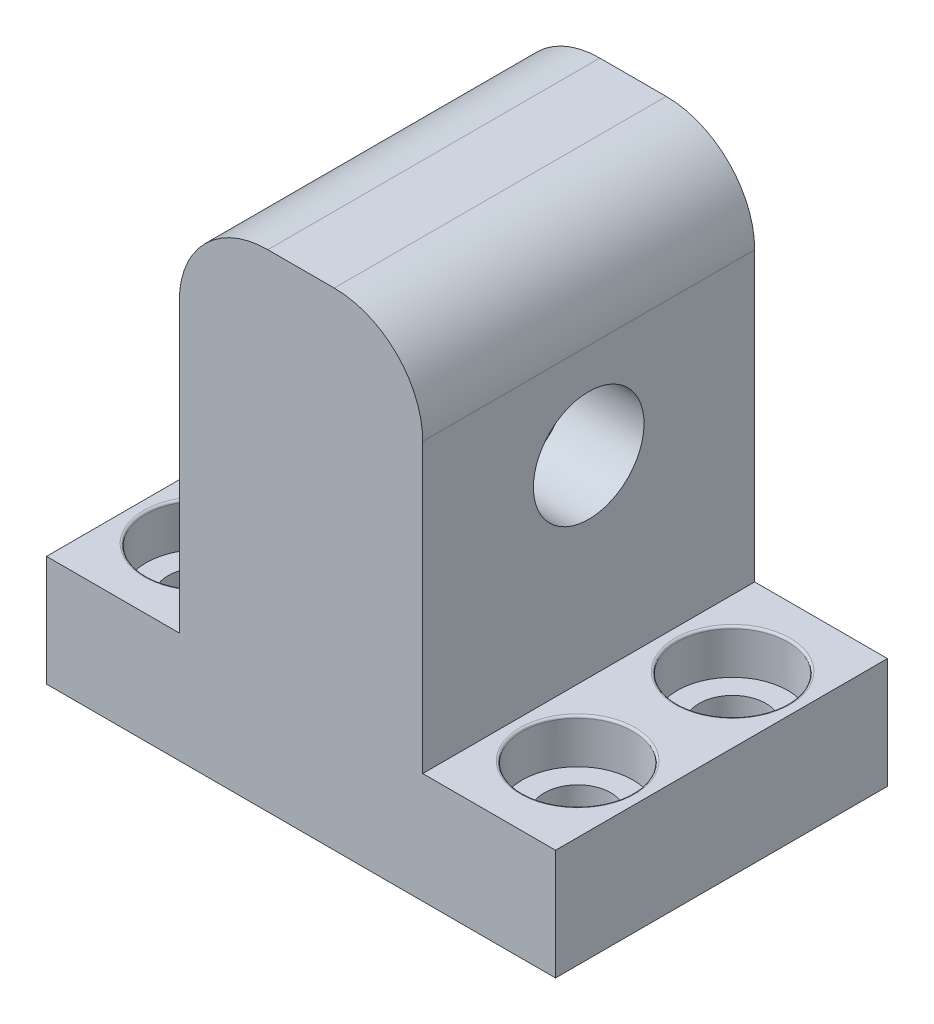
ISO-10303-21;
HEADER;
FILE_DESCRIPTION(('STEP AP214'),'2;1');
FILE_NAME('part.step','',(''),(''),'','','');
FILE_SCHEMA(('AUTOMOTIVE_DESIGN { 1 0 10303 214 1 1 1 1 }'));
ENDSEC;
DATA;
#1=APPLICATION_CONTEXT('core data for automotive mechanical design processes');
#2=APPLICATION_PROTOCOL_DEFINITION('international standard','automotive_design',2000,#1);
#3=PRODUCT_CONTEXT('',#1,'mechanical');
#4=PRODUCT('Part','Part','',(#3));
#5=PRODUCT_RELATED_PRODUCT_CATEGORY('part','',(#4));
#6=PRODUCT_DEFINITION_FORMATION('','',#4);
#7=PRODUCT_DEFINITION_CONTEXT('part definition',#1,'design');
#8=PRODUCT_DEFINITION('design','',#6,#7);
#9=PRODUCT_DEFINITION_SHAPE('','',#8);
#10=(LENGTH_UNIT() NAMED_UNIT(*) SI_UNIT(.MILLI.,.METRE.));
#11=(NAMED_UNIT(*) PLANE_ANGLE_UNIT() SI_UNIT($,.RADIAN.));
#12=(NAMED_UNIT(*) SI_UNIT($,.STERADIAN.) SOLID_ANGLE_UNIT());
#13=UNCERTAINTY_MEASURE_WITH_UNIT(LENGTH_MEASURE(1.E-05),#10,'distance_accuracy_value','');
#14=(GEOMETRIC_REPRESENTATION_CONTEXT(3) GLOBAL_UNCERTAINTY_ASSIGNED_CONTEXT((#13)) GLOBAL_UNIT_ASSIGNED_CONTEXT((#10,
#11,#12)) REPRESENTATION_CONTEXT('',''));
#15=CARTESIAN_POINT('',(0.,0.,0.));
#16=DIRECTION('',(0.,0.,1.));
#17=DIRECTION('',(1.,0.,0.));
#18=AXIS2_PLACEMENT_3D('',#15,#16,#17);
#19=CARTESIAN_POINT('',(-5.49999999999999,-11.,-15.));
#20=DIRECTION('',(0.,-1.,0.));
#21=DIRECTION('',(0.,0.,-1.));
#22=AXIS2_PLACEMENT_3D('',#19,#20,#21);
#23=PLANE('',#22);
#24=CARTESIAN_POINT('',(8.50000000000001,-11.,-11.));
#25=DIRECTION('',(0.,1.,0.));
#26=DIRECTION('',(1.,0.,0.));
#27=AXIS2_PLACEMENT_3D('',#24,#25,#26);
#28=CIRCLE('',#27,1.5);
#29=CARTESIAN_POINT('',(10.,-11.,-11.));
#30=VERTEX_POINT('',#29);
#31=EDGE_CURVE('E450',#30,#30,#28,.T.);
#32=ORIENTED_EDGE('',*,*,#31,.T.);
#33=EDGE_LOOP('',(#32));
#34=FACE_BOUND('',#33,.T.);
#35=CARTESIAN_POINT('',(8.50000000000001,-11.,-4.));
#36=DIRECTION('',(0.,1.,0.));
#37=DIRECTION('',(1.,0.,0.));
#38=AXIS2_PLACEMENT_3D('',#35,#36,#37);
#39=CIRCLE('',#38,1.5);
#40=CARTESIAN_POINT('',(10.,-11.,-4.));
#41=VERTEX_POINT('',#40);
#42=EDGE_CURVE('E453',#41,#41,#39,.T.);
#43=ORIENTED_EDGE('',*,*,#42,.T.);
#44=EDGE_LOOP('',(#43));
#45=FACE_BOUND('',#44,.T.);
#46=CARTESIAN_POINT('',(-8.49999999999999,-11.,-4.));
#47=DIRECTION('',(0.,1.,0.));
#48=DIRECTION('',(-1.,0.,0.));
#49=AXIS2_PLACEMENT_3D('',#46,#47,#48);
#50=CIRCLE('',#49,1.5);
#51=CARTESIAN_POINT('',(-9.99999999999999,-11.,-4.));
#52=VERTEX_POINT('',#51);
#53=EDGE_CURVE('E449',#52,#52,#50,.T.);
#54=ORIENTED_EDGE('',*,*,#53,.T.);
#55=EDGE_LOOP('',(#54));
#56=FACE_BOUND('',#55,.T.);
#57=CARTESIAN_POINT('',(-8.49999999999999,-11.,-11.));
#58=DIRECTION('',(0.,1.,0.));
#59=DIRECTION('',(-1.,0.,0.));
#60=AXIS2_PLACEMENT_3D('',#57,#58,#59);
#61=CIRCLE('',#60,1.5);
#62=CARTESIAN_POINT('',(-9.99999999999999,-11.,-11.));
#63=VERTEX_POINT('',#62);
#64=EDGE_CURVE('E254',#63,#63,#61,.T.);
#65=ORIENTED_EDGE('',*,*,#64,.T.);
#66=EDGE_LOOP('',(#65));
#67=FACE_BOUND('',#66,.T.);
#68=DIRECTION('',(1.,0.,0.));
#69=VECTOR('',#68,1.);
#70=CARTESIAN_POINT('',(-5.49999999999999,-11.,0.));
#71=LINE('',#70,#69);
#72=CARTESIAN_POINT('',(-11.5,-11.,0.));
#73=VERTEX_POINT('',#72);
#74=CARTESIAN_POINT('',(11.5,-11.,0.));
#75=VERTEX_POINT('',#74);
#76=EDGE_CURVE('E102',#73,#75,#71,.T.);
#77=ORIENTED_EDGE('',*,*,#76,.F.);
#78=DIRECTION('',(0.,0.,1.));
#79=VECTOR('',#78,1.);
#80=CARTESIAN_POINT('',(-11.5,-11.,-15.));
#81=LINE('',#80,#79);
#82=CARTESIAN_POINT('',(-11.5,-11.,-15.));
#83=VERTEX_POINT('',#82);
#84=EDGE_CURVE('E198',#83,#73,#81,.T.);
#85=ORIENTED_EDGE('',*,*,#84,.F.);
#86=DIRECTION('',(1.,0.,0.));
#87=VECTOR('',#86,1.);
#88=CARTESIAN_POINT('',(5.50000000000001,-11.,-15.));
#89=LINE('',#88,#87);
#90=CARTESIAN_POINT('',(11.5,-11.,-15.));
#91=VERTEX_POINT('',#90);
#92=EDGE_CURVE('E61',#83,#91,#89,.T.);
#93=ORIENTED_EDGE('',*,*,#92,.T.);
#94=DIRECTION('',(0.,0.,1.));
#95=VECTOR('',#94,1.);
#96=CARTESIAN_POINT('',(11.5,-11.,-15.));
#97=LINE('',#96,#95);
#98=EDGE_CURVE('E110',#91,#75,#97,.T.);
#99=ORIENTED_EDGE('',*,*,#98,.T.);
#100=EDGE_LOOP('',(#77,#85,#93,#99));
#101=FACE_BOUND('',#100,.T.);
#102=ADVANCED_FACE('F41',(#34,#45,#56,#67,#101),#23,.T.);
#103=CARTESIAN_POINT('',(-11.5,-11.,-15.));
#104=DIRECTION('',(-1.,0.,0.));
#105=DIRECTION('',(0.,0.,1.));
#106=AXIS2_PLACEMENT_3D('',#103,#104,#105);
#107=PLANE('',#106);
#108=DIRECTION('',(0.,-1.,0.));
#109=VECTOR('',#108,1.);
#110=CARTESIAN_POINT('',(-11.5,-11.,0.));
#111=LINE('',#110,#109);
#112=CARTESIAN_POINT('',(-11.5,-6.00000000000001,0.));
#113=VERTEX_POINT('',#112);
#114=EDGE_CURVE('E192',#113,#73,#111,.T.);
#115=ORIENTED_EDGE('',*,*,#114,.F.);
#116=DIRECTION('',(0.,0.,1.));
#117=VECTOR('',#116,1.);
#118=CARTESIAN_POINT('',(-11.5,-6.00000000000001,-15.));
#119=LINE('',#118,#117);
#120=CARTESIAN_POINT('',(-11.5,-6.00000000000001,-15.));
#121=VERTEX_POINT('',#120);
#122=EDGE_CURVE('E96',#121,#113,#119,.T.);
#123=ORIENTED_EDGE('',*,*,#122,.F.);
#124=DIRECTION('',(0.,-1.,0.));
#125=VECTOR('',#124,1.);
#126=CARTESIAN_POINT('',(-11.5,-11.,-15.));
#127=LINE('',#126,#125);
#128=EDGE_CURVE('E148',#121,#83,#127,.T.);
#129=ORIENTED_EDGE('',*,*,#128,.T.);
#130=ORIENTED_EDGE('',*,*,#84,.T.);
#131=EDGE_LOOP('',(#115,#123,#129,#130));
#132=FACE_BOUND('',#131,.T.);
#133=ADVANCED_FACE('F335',(#132),#107,.T.);
#134=CARTESIAN_POINT('',(-5.5,-6.00000000000001,-15.));
#135=DIRECTION('',(0.,1.,0.));
#136=DIRECTION('',(-1.,0.,0.));
#137=AXIS2_PLACEMENT_3D('',#134,#135,#136);
#138=PLANE('',#137);
#139=CARTESIAN_POINT('',(-8.49999999999999,-6.00000000000001,-4.));
#140=DIRECTION('',(0.,1.,0.));
#141=DIRECTION('',(-1.,0.,0.));
#142=AXIS2_PLACEMENT_3D('',#139,#140,#141);
#143=CIRCLE('',#142,2.6);
#144=CARTESIAN_POINT('',(-11.1,-6.00000000000001,-4.));
#145=VERTEX_POINT('',#144);
#146=EDGE_CURVE('E52',#145,#145,#143,.F.);
#147=ORIENTED_EDGE('',*,*,#146,.T.);
#148=EDGE_LOOP('',(#147));
#149=FACE_BOUND('',#148,.T.);
#150=CARTESIAN_POINT('',(-8.49999999999999,-6.00000000000001,-11.));
#151=DIRECTION('',(0.,1.,0.));
#152=DIRECTION('',(-1.,0.,0.));
#153=AXIS2_PLACEMENT_3D('',#150,#151,#152);
#154=CIRCLE('',#153,2.6);
#155=CARTESIAN_POINT('',(-11.1,-6.00000000000001,-11.));
#156=VERTEX_POINT('',#155);
#157=EDGE_CURVE('E242',#156,#156,#154,.F.);
#158=ORIENTED_EDGE('',*,*,#157,.T.);
#159=EDGE_LOOP('',(#158));
#160=FACE_BOUND('',#159,.T.);
#161=DIRECTION('',(-1.,0.,0.));
#162=VECTOR('',#161,1.);
#163=CARTESIAN_POINT('',(-5.5,-6.00000000000001,0.));
#164=LINE('',#163,#162);
#165=CARTESIAN_POINT('',(-5.5,-6.00000000000001,0.));
#166=VERTEX_POINT('',#165);
#167=EDGE_CURVE('E134',#166,#113,#164,.T.);
#168=ORIENTED_EDGE('',*,*,#167,.F.);
#169=DIRECTION('',(0.,0.,1.));
#170=VECTOR('',#169,1.);
#171=CARTESIAN_POINT('',(-5.5,-6.00000000000001,-15.));
#172=LINE('',#171,#170);
#173=CARTESIAN_POINT('',(-5.5,-6.00000000000001,-15.));
#174=VERTEX_POINT('',#173);
#175=EDGE_CURVE('E129',#174,#166,#172,.T.);
#176=ORIENTED_EDGE('',*,*,#175,.F.);
#177=DIRECTION('',(-1.,0.,0.));
#178=VECTOR('',#177,1.);
#179=CARTESIAN_POINT('',(-5.5,-6.00000000000001,-15.));
#180=LINE('',#179,#178);
#181=EDGE_CURVE('E132',#174,#121,#180,.T.);
#182=ORIENTED_EDGE('',*,*,#181,.T.);
#183=ORIENTED_EDGE('',*,*,#122,.T.);
#184=EDGE_LOOP('',(#168,#176,#182,#183));
#185=FACE_BOUND('',#184,.T.);
#186=ADVANCED_FACE('F131',(#149,#160,#185),#138,.T.);
#187=CARTESIAN_POINT('',(-5.49999999999999,7.00000000000001,-15.));
#188=DIRECTION('',(-1.,0.,0.));
#189=DIRECTION('',(0.,-1.,0.));
#190=AXIS2_PLACEMENT_3D('',#187,#188,#189);
#191=PLANE('',#190);
#192=CARTESIAN_POINT('',(-5.49999999999999,2.7,-7.5));
#193=DIRECTION('',(-1.,0.,0.));
#194=DIRECTION('',(0.,-1.,0.));
#195=AXIS2_PLACEMENT_3D('',#192,#193,#194);
#196=CIRCLE('',#195,2.5);
#197=CARTESIAN_POINT('',(-5.49999999999999,0.2,-7.5));
#198=VERTEX_POINT('',#197);
#199=EDGE_CURVE('E283',#198,#198,#196,.T.);
#200=ORIENTED_EDGE('',*,*,#199,.F.);
#201=EDGE_LOOP('',(#200));
#202=FACE_BOUND('',#201,.T.);
#203=DIRECTION('',(0.,-1.,0.));
#204=VECTOR('',#203,1.);
#205=CARTESIAN_POINT('',(-5.49999999999999,7.00000000000001,0.));
#206=LINE('',#205,#204);
#207=CARTESIAN_POINT('',(-5.49999999999999,7.00000000000001,0.));
#208=VERTEX_POINT('',#207);
#209=EDGE_CURVE('E187',#208,#166,#206,.T.);
#210=ORIENTED_EDGE('',*,*,#209,.F.);
#211=DIRECTION('',(0.,0.,1.));
#212=VECTOR('',#211,1.);
#213=CARTESIAN_POINT('',(-5.49999999999999,7.00000000000001,-15.));
#214=LINE('',#213,#212);
#215=CARTESIAN_POINT('',(-5.49999999999999,7.00000000000001,-15.));
#216=VERTEX_POINT('',#215);
#217=EDGE_CURVE('E140',#216,#208,#214,.T.);
#218=ORIENTED_EDGE('',*,*,#217,.F.);
#219=DIRECTION('',(0.,-1.,0.));
#220=VECTOR('',#219,1.);
#221=CARTESIAN_POINT('',(-5.49999999999999,7.00000000000001,-15.));
#222=LINE('',#221,#220);
#223=EDGE_CURVE('E145',#216,#174,#222,.T.);
#224=ORIENTED_EDGE('',*,*,#223,.T.);
#225=ORIENTED_EDGE('',*,*,#175,.T.);
#226=EDGE_LOOP('',(#210,#218,#224,#225));
#227=FACE_BOUND('',#226,.T.);
#228=ADVANCED_FACE('F151',(#202,#227),#191,.T.);
#229=CARTESIAN_POINT('',(-1.49999999999999,7.00000000000001,-15.));
#230=DIRECTION('',(0.,0.,1.));
#231=DIRECTION('',(1.,0.,0.));
#232=AXIS2_PLACEMENT_3D('',#229,#230,#231);
#233=CYLINDRICAL_SURFACE('',#232,4.);
#234=CARTESIAN_POINT('',(-1.49999999999999,7.00000000000001,0.));
#235=DIRECTION('',(0.,0.,1.));
#236=DIRECTION('',(-1.,0.,0.));
#237=AXIS2_PLACEMENT_3D('',#234,#235,#236);
#238=CIRCLE('',#237,4.);
#239=CARTESIAN_POINT('',(-1.49999999999999,11.,0.));
#240=VERTEX_POINT('',#239);
#241=EDGE_CURVE('E183',#240,#208,#238,.T.);
#242=ORIENTED_EDGE('',*,*,#241,.F.);
#243=DIRECTION('',(0.,0.,1.));
#244=VECTOR('',#243,1.);
#245=CARTESIAN_POINT('',(-1.49999999999999,11.,-15.));
#246=LINE('',#245,#244);
#247=CARTESIAN_POINT('',(-1.49999999999999,11.,-15.));
#248=VERTEX_POINT('',#247);
#249=EDGE_CURVE('E206',#248,#240,#246,.T.);
#250=ORIENTED_EDGE('',*,*,#249,.F.);
#251=CARTESIAN_POINT('',(-1.49999999999999,7.00000000000001,-15.));
#252=DIRECTION('',(0.,0.,1.));
#253=DIRECTION('',(-1.,0.,0.));
#254=AXIS2_PLACEMENT_3D('',#251,#252,#253);
#255=CIRCLE('',#254,4.);
#256=EDGE_CURVE('E153',#248,#216,#255,.T.);
#257=ORIENTED_EDGE('',*,*,#256,.T.);
#258=ORIENTED_EDGE('',*,*,#217,.T.);
#259=EDGE_LOOP('',(#242,#250,#257,#258));
#260=FACE_BOUND('',#259,.T.);
#261=ADVANCED_FACE('F339',(#260),#233,.T.);
#262=CARTESIAN_POINT('',(-1.49999999999999,11.,-15.));
#263=DIRECTION('',(0.,1.,0.));
#264=DIRECTION('',(0.,0.,1.));
#265=AXIS2_PLACEMENT_3D('',#262,#263,#264);
#266=PLANE('',#265);
#267=DIRECTION('',(-1.,0.,0.));
#268=VECTOR('',#267,1.);
#269=CARTESIAN_POINT('',(-1.49999999999999,11.,0.));
#270=LINE('',#269,#268);
#271=CARTESIAN_POINT('',(1.5,11.,0.));
#272=VERTEX_POINT('',#271);
#273=EDGE_CURVE('E179',#272,#240,#270,.T.);
#274=ORIENTED_EDGE('',*,*,#273,.F.);
#275=DIRECTION('',(0.,0.,1.));
#276=VECTOR('',#275,1.);
#277=CARTESIAN_POINT('',(1.5,11.,-15.));
#278=LINE('',#277,#276);
#279=CARTESIAN_POINT('',(1.5,11.,-15.));
#280=VERTEX_POINT('',#279);
#281=EDGE_CURVE('E209',#280,#272,#278,.T.);
#282=ORIENTED_EDGE('',*,*,#281,.F.);
#283=DIRECTION('',(-1.,0.,0.));
#284=VECTOR('',#283,1.);
#285=CARTESIAN_POINT('',(-1.49999999999999,11.,-15.));
#286=LINE('',#285,#284);
#287=EDGE_CURVE('E156',#280,#248,#286,.T.);
#288=ORIENTED_EDGE('',*,*,#287,.T.);
#289=ORIENTED_EDGE('',*,*,#249,.T.);
#290=EDGE_LOOP('',(#274,#282,#288,#289));
#291=FACE_BOUND('',#290,.T.);
#292=ADVANCED_FACE('F319',(#291),#266,.T.);
#293=CARTESIAN_POINT('',(1.5,7.00000000000001,-15.));
#294=DIRECTION('',(0.,0.,1.));
#295=DIRECTION('',(1.,0.,0.));
#296=AXIS2_PLACEMENT_3D('',#293,#294,#295);
#297=CYLINDRICAL_SURFACE('',#296,4.);
#298=CARTESIAN_POINT('',(1.5,7.00000000000001,0.));
#299=DIRECTION('',(0.,0.,1.));
#300=DIRECTION('',(1.,0.,0.));
#301=AXIS2_PLACEMENT_3D('',#298,#299,#300);
#302=CIRCLE('',#301,4.);
#303=CARTESIAN_POINT('',(5.5,7.00000000000001,0.));
#304=VERTEX_POINT('',#303);
#305=EDGE_CURVE('E175',#304,#272,#302,.T.);
#306=ORIENTED_EDGE('',*,*,#305,.F.);
#307=DIRECTION('',(0.,0.,1.));
#308=VECTOR('',#307,1.);
#309=CARTESIAN_POINT('',(5.5,7.00000000000001,-15.));
#310=LINE('',#309,#308);
#311=CARTESIAN_POINT('',(5.5,7.00000000000001,-15.));
#312=VERTEX_POINT('',#311);
#313=EDGE_CURVE('E212',#312,#304,#310,.T.);
#314=ORIENTED_EDGE('',*,*,#313,.F.);
#315=CARTESIAN_POINT('',(1.5,7.00000000000001,-15.));
#316=DIRECTION('',(0.,0.,1.));
#317=DIRECTION('',(1.,0.,0.));
#318=AXIS2_PLACEMENT_3D('',#315,#316,#317);
#319=CIRCLE('',#318,4.);
#320=EDGE_CURVE('E311',#312,#280,#319,.T.);
#321=ORIENTED_EDGE('',*,*,#320,.T.);
#322=ORIENTED_EDGE('',*,*,#281,.T.);
#323=EDGE_LOOP('',(#306,#314,#321,#322));
#324=FACE_BOUND('',#323,.T.);
#325=ADVANCED_FACE('F325',(#324),#297,.T.);
#326=CARTESIAN_POINT('',(5.5,7.00000000000001,-15.));
#327=DIRECTION('',(1.,0.,0.));
#328=DIRECTION('',(0.,1.,0.));
#329=AXIS2_PLACEMENT_3D('',#326,#327,#328);
#330=PLANE('',#329);
#331=CARTESIAN_POINT('',(5.5,2.70000000000001,-7.5));
#332=DIRECTION('',(1.,0.,0.));
#333=DIRECTION('',(0.,1.,0.));
#334=AXIS2_PLACEMENT_3D('',#331,#332,#333);
#335=CIRCLE('',#334,2.5);
#336=CARTESIAN_POINT('',(5.5,5.2,-7.5));
#337=VERTEX_POINT('',#336);
#338=EDGE_CURVE('E288',#337,#337,#335,.T.);
#339=ORIENTED_EDGE('',*,*,#338,.F.);
#340=EDGE_LOOP('',(#339));
#341=FACE_BOUND('',#340,.T.);
#342=DIRECTION('',(0.,1.,0.));
#343=VECTOR('',#342,1.);
#344=CARTESIAN_POINT('',(5.5,7.00000000000001,0.));
#345=LINE('',#344,#343);
#346=CARTESIAN_POINT('',(5.5,-6.,0.));
#347=VERTEX_POINT('',#346);
#348=EDGE_CURVE('E171',#347,#304,#345,.T.);
#349=ORIENTED_EDGE('',*,*,#348,.F.);
#350=DIRECTION('',(0.,0.,1.));
#351=VECTOR('',#350,1.);
#352=CARTESIAN_POINT('',(5.5,-6.,-15.));
#353=LINE('',#352,#351);
#354=CARTESIAN_POINT('',(5.5,-6.,-15.));
#355=VERTEX_POINT('',#354);
#356=EDGE_CURVE('E215',#355,#347,#353,.T.);
#357=ORIENTED_EDGE('',*,*,#356,.F.);
#358=DIRECTION('',(0.,1.,0.));
#359=VECTOR('',#358,1.);
#360=CARTESIAN_POINT('',(5.5,7.00000000000001,-15.));
#361=LINE('',#360,#359);
#362=EDGE_CURVE('E307',#355,#312,#361,.T.);
#363=ORIENTED_EDGE('',*,*,#362,.T.);
#364=ORIENTED_EDGE('',*,*,#313,.T.);
#365=EDGE_LOOP('',(#349,#357,#363,#364));
#366=FACE_BOUND('',#365,.T.);
#367=ADVANCED_FACE('F328',(#341,#366),#330,.T.);
#368=CARTESIAN_POINT('',(5.5,-6.,-15.));
#369=DIRECTION('',(0.,1.,0.));
#370=DIRECTION('',(-1.,0.,0.));
#371=AXIS2_PLACEMENT_3D('',#368,#369,#370);
#372=PLANE('',#371);
#373=CARTESIAN_POINT('',(8.5,-6.,-3.99999999999999));
#374=DIRECTION('',(0.,1.,0.));
#375=DIRECTION('',(-1.,0.,0.));
#376=AXIS2_PLACEMENT_3D('',#373,#374,#375);
#377=CIRCLE('',#376,2.6);
#378=CARTESIAN_POINT('',(5.9,-6.,-3.99999999999999));
#379=VERTEX_POINT('',#378);
#380=EDGE_CURVE('E230',#379,#379,#377,.F.);
#381=ORIENTED_EDGE('',*,*,#380,.T.);
#382=EDGE_LOOP('',(#381));
#383=FACE_BOUND('',#382,.T.);
#384=CARTESIAN_POINT('',(8.50000000000001,-6.,-11.));
#385=DIRECTION('',(0.,1.,0.));
#386=DIRECTION('',(-1.,0.,0.));
#387=AXIS2_PLACEMENT_3D('',#384,#385,#386);
#388=CIRCLE('',#387,2.6);
#389=CARTESIAN_POINT('',(5.90000000000001,-6.,-11.));
#390=VERTEX_POINT('',#389);
#391=EDGE_CURVE('E226',#390,#390,#388,.F.);
#392=ORIENTED_EDGE('',*,*,#391,.T.);
#393=EDGE_LOOP('',(#392));
#394=FACE_BOUND('',#393,.T.);
#395=DIRECTION('',(-1.,0.,0.));
#396=VECTOR('',#395,1.);
#397=CARTESIAN_POINT('',(5.5,-6.,0.));
#398=LINE('',#397,#396);
#399=CARTESIAN_POINT('',(11.5,-6.00000000000001,0.));
#400=VERTEX_POINT('',#399);
#401=EDGE_CURVE('E166',#400,#347,#398,.T.);
#402=ORIENTED_EDGE('',*,*,#401,.F.);
#403=DIRECTION('',(0.,0.,1.));
#404=VECTOR('',#403,1.);
#405=CARTESIAN_POINT('',(11.5,-6.00000000000001,-15.));
#406=LINE('',#405,#404);
#407=CARTESIAN_POINT('',(11.5,-6.00000000000001,-15.));
#408=VERTEX_POINT('',#407);
#409=EDGE_CURVE('E218',#408,#400,#406,.T.);
#410=ORIENTED_EDGE('',*,*,#409,.F.);
#411=DIRECTION('',(-1.,0.,0.));
#412=VECTOR('',#411,1.);
#413=CARTESIAN_POINT('',(5.5,-6.,-15.));
#414=LINE('',#413,#412);
#415=EDGE_CURVE('E303',#408,#355,#414,.T.);
#416=ORIENTED_EDGE('',*,*,#415,.T.);
#417=ORIENTED_EDGE('',*,*,#356,.T.);
#418=EDGE_LOOP('',(#402,#410,#416,#417));
#419=FACE_BOUND('',#418,.T.);
#420=ADVANCED_FACE('F332',(#383,#394,#419),#372,.T.);
#421=CARTESIAN_POINT('',(11.5,-11.,-15.));
#422=DIRECTION('',(1.,0.,0.));
#423=DIRECTION('',(0.,1.,0.));
#424=AXIS2_PLACEMENT_3D('',#421,#422,#423);
#425=PLANE('',#424);
#426=DIRECTION('',(0.,1.,0.));
#427=VECTOR('',#426,1.);
#428=CARTESIAN_POINT('',(11.5,-11.,0.));
#429=LINE('',#428,#427);
#430=EDGE_CURVE('E162',#75,#400,#429,.T.);
#431=ORIENTED_EDGE('',*,*,#430,.F.);
#432=ORIENTED_EDGE('',*,*,#98,.F.);
#433=DIRECTION('',(0.,1.,0.));
#434=VECTOR('',#433,1.);
#435=CARTESIAN_POINT('',(11.5,-11.,-15.));
#436=LINE('',#435,#434);
#437=EDGE_CURVE('E300',#91,#408,#436,.T.);
#438=ORIENTED_EDGE('',*,*,#437,.T.);
#439=ORIENTED_EDGE('',*,*,#409,.T.);
#440=EDGE_LOOP('',(#431,#432,#438,#439));
#441=FACE_BOUND('',#440,.T.);
#442=ADVANCED_FACE('F333',(#441),#425,.T.);
#443=CARTESIAN_POINT('',(1.5,7.00000000000001,-15.));
#444=DIRECTION('',(0.,0.,1.));
#445=DIRECTION('',(1.,0.,0.));
#446=AXIS2_PLACEMENT_3D('',#443,#444,#445);
#447=PLANE('',#446);
#448=ORIENTED_EDGE('',*,*,#92,.F.);
#449=ORIENTED_EDGE('',*,*,#128,.F.);
#450=ORIENTED_EDGE('',*,*,#181,.F.);
#451=ORIENTED_EDGE('',*,*,#223,.F.);
#452=ORIENTED_EDGE('',*,*,#256,.F.);
#453=ORIENTED_EDGE('',*,*,#287,.F.);
#454=ORIENTED_EDGE('',*,*,#320,.F.);
#455=ORIENTED_EDGE('',*,*,#362,.F.);
#456=ORIENTED_EDGE('',*,*,#415,.F.);
#457=ORIENTED_EDGE('',*,*,#437,.F.);
#458=EDGE_LOOP('',(#448,#449,#450,#451,#452,#453,#454,#455,#456,#457));
#459=FACE_BOUND('',#458,.T.);
#460=ADVANCED_FACE('F143',(#459),#447,.F.);
#461=CARTESIAN_POINT('',(1.5,7.00000000000001,0.));
#462=DIRECTION('',(0.,0.,1.));
#463=DIRECTION('',(1.,0.,0.));
#464=AXIS2_PLACEMENT_3D('',#461,#462,#463);
#465=PLANE('',#464);
#466=ORIENTED_EDGE('',*,*,#76,.T.);
#467=ORIENTED_EDGE('',*,*,#430,.T.);
#468=ORIENTED_EDGE('',*,*,#401,.T.);
#469=ORIENTED_EDGE('',*,*,#348,.T.);
#470=ORIENTED_EDGE('',*,*,#305,.T.);
#471=ORIENTED_EDGE('',*,*,#273,.T.);
#472=ORIENTED_EDGE('',*,*,#241,.T.);
#473=ORIENTED_EDGE('',*,*,#209,.T.);
#474=ORIENTED_EDGE('',*,*,#167,.T.);
#475=ORIENTED_EDGE('',*,*,#114,.T.);
#476=EDGE_LOOP('',(#466,#467,#468,#469,#470,#471,#472,#473,#474,#475));
#477=FACE_BOUND('',#476,.T.);
#478=ADVANCED_FACE('F337',(#477),#465,.T.);
#479=CARTESIAN_POINT('',(2.,2.70000000000001,-7.5));
#480=DIRECTION('',(1.,0.,0.));
#481=DIRECTION('',(0.,1.,0.));
#482=AXIS2_PLACEMENT_3D('',#479,#480,#481);
#483=CYLINDRICAL_SURFACE('',#482,2.5);
#484=CARTESIAN_POINT('',(2.,2.70000000000001,-7.5));
#485=DIRECTION('',(1.,0.,0.));
#486=DIRECTION('',(0.,1.,0.));
#487=AXIS2_PLACEMENT_3D('',#484,#485,#486);
#488=CIRCLE('',#487,2.5);
#489=CARTESIAN_POINT('',(2.,5.2,-7.5));
#490=VERTEX_POINT('',#489);
#491=EDGE_CURVE('E167',#490,#490,#488,.T.);
#492=ORIENTED_EDGE('',*,*,#491,.F.);
#493=EDGE_LOOP('',(#492));
#494=FACE_BOUND('',#493,.T.);
#495=ORIENTED_EDGE('',*,*,#338,.T.);
#496=EDGE_LOOP('',(#495));
#497=FACE_BOUND('',#496,.T.);
#498=ADVANCED_FACE('F410',(#494,#497),#483,.F.);
#499=CARTESIAN_POINT('',(2.,2.70000000000001,-7.5));
#500=DIRECTION('',(1.,0.,0.));
#501=DIRECTION('',(0.,1.,0.));
#502=AXIS2_PLACEMENT_3D('',#499,#500,#501);
#503=PLANE('',#502);
#504=ORIENTED_EDGE('',*,*,#491,.T.);
#505=EDGE_LOOP('',(#504));
#506=FACE_BOUND('',#505,.T.);
#507=ADVANCED_FACE('F406',(#506),#503,.T.);
#508=CARTESIAN_POINT('',(-1.99999999999999,2.7,-7.5));
#509=DIRECTION('',(-1.,0.,0.));
#510=DIRECTION('',(0.,-1.,0.));
#511=AXIS2_PLACEMENT_3D('',#508,#509,#510);
#512=CYLINDRICAL_SURFACE('',#511,2.5);
#513=CARTESIAN_POINT('',(-1.99999999999999,2.7,-7.5));
#514=DIRECTION('',(-1.,0.,0.));
#515=DIRECTION('',(0.,-1.,0.));
#516=AXIS2_PLACEMENT_3D('',#513,#514,#515);
#517=CIRCLE('',#516,2.5);
#518=CARTESIAN_POINT('',(-1.99999999999999,0.199999999999998,-7.5));
#519=VERTEX_POINT('',#518);
#520=EDGE_CURVE('E284',#519,#519,#517,.T.);
#521=ORIENTED_EDGE('',*,*,#520,.F.);
#522=EDGE_LOOP('',(#521));
#523=FACE_BOUND('',#522,.T.);
#524=ORIENTED_EDGE('',*,*,#199,.T.);
#525=EDGE_LOOP('',(#524));
#526=FACE_BOUND('',#525,.T.);
#527=ADVANCED_FACE('F402',(#523,#526),#512,.F.);
#528=CARTESIAN_POINT('',(-1.99999999999999,2.7,-7.5));
#529=DIRECTION('',(-1.,0.,0.));
#530=DIRECTION('',(0.,-1.,0.));
#531=AXIS2_PLACEMENT_3D('',#528,#529,#530);
#532=PLANE('',#531);
#533=ORIENTED_EDGE('',*,*,#520,.T.);
#534=EDGE_LOOP('',(#533));
#535=FACE_BOUND('',#534,.T.);
#536=ADVANCED_FACE('F398',(#535),#532,.T.);
#537=CARTESIAN_POINT('',(8.5,-8.00000000000001,-3.99999999999999));
#538=DIRECTION('',(0.,1.,0.));
#539=DIRECTION('',(-1.,0.,0.));
#540=AXIS2_PLACEMENT_3D('',#537,#538,#539);
#541=CYLINDRICAL_SURFACE('',#540,2.5);
#542=CARTESIAN_POINT('',(8.5,-6.1,-3.99999999999999));
#543=DIRECTION('',(0.,1.,0.));
#544=DIRECTION('',(-1.,0.,0.));
#545=AXIS2_PLACEMENT_3D('',#542,#543,#544);
#546=CIRCLE('',#545,2.5);
#547=CARTESIAN_POINT('',(6.,-6.1,-3.99999999999999));
#548=VERTEX_POINT('',#547);
#549=EDGE_CURVE('E201',#548,#548,#546,.T.);
#550=ORIENTED_EDGE('',*,*,#549,.T.);
#551=EDGE_LOOP('',(#550));
#552=FACE_BOUND('',#551,.T.);
#553=CARTESIAN_POINT('',(8.5,-8.00000000000001,-3.99999999999999));
#554=DIRECTION('',(0.,1.,0.));
#555=DIRECTION('',(1.,0.,0.));
#556=AXIS2_PLACEMENT_3D('',#553,#554,#555);
#557=CIRCLE('',#556,2.5);
#558=CARTESIAN_POINT('',(11.,-8.00000000000001,-3.99999999999999));
#559=VERTEX_POINT('',#558);
#560=EDGE_CURVE('E269',#559,#559,#557,.T.);
#561=ORIENTED_EDGE('',*,*,#560,.F.);
#562=EDGE_LOOP('',(#561));
#563=FACE_BOUND('',#562,.T.);
#564=ADVANCED_FACE('F401',(#552,#563),#541,.F.);
#565=CARTESIAN_POINT('',(8.5,-8.00000000000001,-3.99999999999999));
#566=DIRECTION('',(0.,-1.,0.));
#567=DIRECTION('',(1.,0.,0.));
#568=AXIS2_PLACEMENT_3D('',#565,#566,#567);
#569=PLANE('',#568);
#570=CARTESIAN_POINT('',(8.50000000000001,-8.00000000000001,-4.));
#571=DIRECTION('',(0.,-1.,0.));
#572=DIRECTION('',(1.,0.,0.));
#573=AXIS2_PLACEMENT_3D('',#570,#571,#572);
#574=CIRCLE('',#573,1.5);
#575=CARTESIAN_POINT('',(10.,-8.00000000000001,-4.));
#576=VERTEX_POINT('',#575);
#577=EDGE_CURVE('E45',#576,#576,#574,.T.);
#578=ORIENTED_EDGE('',*,*,#577,.T.);
#579=EDGE_LOOP('',(#578));
#580=FACE_BOUND('',#579,.T.);
#581=ORIENTED_EDGE('',*,*,#560,.T.);
#582=EDGE_LOOP('',(#581));
#583=FACE_BOUND('',#582,.T.);
#584=ADVANCED_FACE('F484',(#580,#583),#569,.F.);
#585=CARTESIAN_POINT('',(8.50000000000001,-8.00000000000001,-11.));
#586=DIRECTION('',(0.,1.,0.));
#587=DIRECTION('',(-1.,0.,0.));
#588=AXIS2_PLACEMENT_3D('',#585,#586,#587);
#589=CYLINDRICAL_SURFACE('',#588,2.5);
#590=CARTESIAN_POINT('',(8.50000000000001,-6.1,-11.));
#591=DIRECTION('',(0.,1.,0.));
#592=DIRECTION('',(-1.,0.,0.));
#593=AXIS2_PLACEMENT_3D('',#590,#591,#592);
#594=CIRCLE('',#593,2.5);
#595=CARTESIAN_POINT('',(6.00000000000001,-6.1,-11.));
#596=VERTEX_POINT('',#595);
#597=EDGE_CURVE('E234',#596,#596,#594,.T.);
#598=ORIENTED_EDGE('',*,*,#597,.T.);
#599=EDGE_LOOP('',(#598));
#600=FACE_BOUND('',#599,.T.);
#601=CARTESIAN_POINT('',(8.50000000000001,-8.00000000000001,-11.));
#602=DIRECTION('',(0.,1.,0.));
#603=DIRECTION('',(1.,0.,0.));
#604=AXIS2_PLACEMENT_3D('',#601,#602,#603);
#605=CIRCLE('',#604,2.5);
#606=CARTESIAN_POINT('',(11.,-8.00000000000001,-11.));
#607=VERTEX_POINT('',#606);
#608=EDGE_CURVE('E264',#607,#607,#605,.T.);
#609=ORIENTED_EDGE('',*,*,#608,.F.);
#610=EDGE_LOOP('',(#609));
#611=FACE_BOUND('',#610,.T.);
#612=ADVANCED_FACE('F395',(#600,#611),#589,.F.);
#613=CARTESIAN_POINT('',(8.50000000000001,-8.00000000000001,-11.));
#614=DIRECTION('',(0.,-1.,0.));
#615=DIRECTION('',(1.,0.,0.));
#616=AXIS2_PLACEMENT_3D('',#613,#614,#615);
#617=PLANE('',#616);
#618=CARTESIAN_POINT('',(8.50000000000001,-8.00000000000001,-11.));
#619=DIRECTION('',(0.,-1.,0.));
#620=DIRECTION('',(1.,0.,0.));
#621=AXIS2_PLACEMENT_3D('',#618,#619,#620);
#622=CIRCLE('',#621,1.5);
#623=CARTESIAN_POINT('',(10.,-8.00000000000001,-11.));
#624=VERTEX_POINT('',#623);
#625=EDGE_CURVE('E257',#624,#624,#622,.T.);
#626=ORIENTED_EDGE('',*,*,#625,.T.);
#627=EDGE_LOOP('',(#626));
#628=FACE_BOUND('',#627,.T.);
#629=ORIENTED_EDGE('',*,*,#608,.T.);
#630=EDGE_LOOP('',(#629));
#631=FACE_BOUND('',#630,.T.);
#632=ADVANCED_FACE('F379',(#628,#631),#617,.F.);
#633=CARTESIAN_POINT('',(-8.49999999999999,-8.00000000000001,-11.));
#634=DIRECTION('',(0.,1.,0.));
#635=DIRECTION('',(-1.,0.,0.));
#636=AXIS2_PLACEMENT_3D('',#633,#634,#635);
#637=CYLINDRICAL_SURFACE('',#636,2.5);
#638=CARTESIAN_POINT('',(-8.49999999999999,-6.10000000000001,-11.));
#639=DIRECTION('',(0.,1.,0.));
#640=DIRECTION('',(-1.,0.,0.));
#641=AXIS2_PLACEMENT_3D('',#638,#639,#640);
#642=CIRCLE('',#641,2.5);
#643=CARTESIAN_POINT('',(-11.,-6.10000000000001,-11.));
#644=VERTEX_POINT('',#643);
#645=EDGE_CURVE('E11',#644,#644,#642,.T.);
#646=ORIENTED_EDGE('',*,*,#645,.T.);
#647=EDGE_LOOP('',(#646));
#648=FACE_BOUND('',#647,.T.);
#649=CARTESIAN_POINT('',(-8.49999999999999,-8.00000000000001,-11.));
#650=DIRECTION('',(0.,1.,0.));
#651=DIRECTION('',(-1.,0.,0.));
#652=AXIS2_PLACEMENT_3D('',#649,#650,#651);
#653=CIRCLE('',#652,2.5);
#654=CARTESIAN_POINT('',(-11.,-8.00000000000001,-11.));
#655=VERTEX_POINT('',#654);
#656=EDGE_CURVE('E279',#655,#655,#653,.T.);
#657=ORIENTED_EDGE('',*,*,#656,.F.);
#658=EDGE_LOOP('',(#657));
#659=FACE_BOUND('',#658,.T.);
#660=ADVANCED_FACE('F375',(#648,#659),#637,.F.);
#661=CARTESIAN_POINT('',(-8.49999999999999,-8.00000000000001,-11.));
#662=DIRECTION('',(0.,1.,0.));
#663=DIRECTION('',(-1.,0.,0.));
#664=AXIS2_PLACEMENT_3D('',#661,#662,#663);
#665=PLANE('',#664);
#666=CARTESIAN_POINT('',(-8.49999999999999,-8.00000000000001,-11.));
#667=DIRECTION('',(0.,1.,0.));
#668=DIRECTION('',(-1.,0.,0.));
#669=AXIS2_PLACEMENT_3D('',#666,#667,#668);
#670=CIRCLE('',#669,1.5);
#671=CARTESIAN_POINT('',(-9.99999999999999,-8.00000000000001,-11.));
#672=VERTEX_POINT('',#671);
#673=EDGE_CURVE('E253',#672,#672,#670,.T.);
#674=ORIENTED_EDGE('',*,*,#673,.F.);
#675=EDGE_LOOP('',(#674));
#676=FACE_BOUND('',#675,.T.);
#677=ORIENTED_EDGE('',*,*,#656,.T.);
#678=EDGE_LOOP('',(#677));
#679=FACE_BOUND('',#678,.T.);
#680=ADVANCED_FACE('F378',(#676,#679),#665,.T.);
#681=CARTESIAN_POINT('',(-8.49999999999999,-8.00000000000001,-4.));
#682=DIRECTION('',(0.,1.,0.));
#683=DIRECTION('',(-1.,0.,0.));
#684=AXIS2_PLACEMENT_3D('',#681,#682,#683);
#685=CYLINDRICAL_SURFACE('',#684,2.5);
#686=CARTESIAN_POINT('',(-8.49999999999999,-6.10000000000001,-4.));
#687=DIRECTION('',(0.,1.,0.));
#688=DIRECTION('',(-1.,0.,0.));
#689=AXIS2_PLACEMENT_3D('',#686,#687,#688);
#690=CIRCLE('',#689,2.5);
#691=CARTESIAN_POINT('',(-11.,-6.10000000000001,-4.));
#692=VERTEX_POINT('',#691);
#693=EDGE_CURVE('E238',#692,#692,#690,.T.);
#694=ORIENTED_EDGE('',*,*,#693,.T.);
#695=EDGE_LOOP('',(#694));
#696=FACE_BOUND('',#695,.T.);
#697=CARTESIAN_POINT('',(-8.49999999999999,-8.00000000000001,-4.));
#698=DIRECTION('',(0.,1.,0.));
#699=DIRECTION('',(-1.,0.,0.));
#700=AXIS2_PLACEMENT_3D('',#697,#698,#699);
#701=CIRCLE('',#700,2.5);
#702=CARTESIAN_POINT('',(-11.,-8.00000000000001,-4.));
#703=VERTEX_POINT('',#702);
#704=EDGE_CURVE('E275',#703,#703,#701,.T.);
#705=ORIENTED_EDGE('',*,*,#704,.F.);
#706=EDGE_LOOP('',(#705));
#707=FACE_BOUND('',#706,.T.);
#708=ADVANCED_FACE('F384',(#696,#707),#685,.F.);
#709=CARTESIAN_POINT('',(-8.49999999999999,-8.00000000000001,-4.));
#710=DIRECTION('',(0.,1.,0.));
#711=DIRECTION('',(-1.,0.,0.));
#712=AXIS2_PLACEMENT_3D('',#709,#710,#711);
#713=PLANE('',#712);
#714=CARTESIAN_POINT('',(-8.49999999999999,-8.00000000000001,-4.));
#715=DIRECTION('',(0.,1.,0.));
#716=DIRECTION('',(-1.,0.,0.));
#717=AXIS2_PLACEMENT_3D('',#714,#715,#716);
#718=CIRCLE('',#717,1.5);
#719=CARTESIAN_POINT('',(-9.99999999999999,-8.00000000000001,-4.));
#720=VERTEX_POINT('',#719);
#721=EDGE_CURVE('E249',#720,#720,#718,.T.);
#722=ORIENTED_EDGE('',*,*,#721,.F.);
#723=EDGE_LOOP('',(#722));
#724=FACE_BOUND('',#723,.T.);
#725=ORIENTED_EDGE('',*,*,#704,.T.);
#726=EDGE_LOOP('',(#725));
#727=FACE_BOUND('',#726,.T.);
#728=ADVANCED_FACE('F390',(#724,#727),#713,.T.);
#729=CARTESIAN_POINT('',(8.5,-6.1,-3.99999999999999));
#730=DIRECTION('',(0.,1.,0.));
#731=DIRECTION('',(-1.,0.,0.));
#732=AXIS2_PLACEMENT_3D('',#729,#730,#731);
#733=TOROIDAL_SURFACE('',#732,2.6,0.1);
#734=ORIENTED_EDGE('',*,*,#380,.F.);
#735=EDGE_LOOP('',(#734));
#736=FACE_BOUND('',#735,.T.);
#737=ORIENTED_EDGE('',*,*,#549,.F.);
#738=EDGE_LOOP('',(#737));
#739=FACE_BOUND('',#738,.T.);
#740=ADVANCED_FACE('F427',(#736,#739),#733,.T.);
#741=CARTESIAN_POINT('',(8.50000000000001,-6.1,-11.));
#742=DIRECTION('',(0.,1.,0.));
#743=DIRECTION('',(-1.,0.,0.));
#744=AXIS2_PLACEMENT_3D('',#741,#742,#743);
#745=TOROIDAL_SURFACE('',#744,2.6,0.1);
#746=ORIENTED_EDGE('',*,*,#391,.F.);
#747=EDGE_LOOP('',(#746));
#748=FACE_BOUND('',#747,.T.);
#749=ORIENTED_EDGE('',*,*,#597,.F.);
#750=EDGE_LOOP('',(#749));
#751=FACE_BOUND('',#750,.T.);
#752=ADVANCED_FACE('F430',(#748,#751),#745,.T.);
#753=CARTESIAN_POINT('',(-8.49999999999999,-6.10000000000001,-4.));
#754=DIRECTION('',(0.,1.,0.));
#755=DIRECTION('',(-1.,0.,0.));
#756=AXIS2_PLACEMENT_3D('',#753,#754,#755);
#757=TOROIDAL_SURFACE('',#756,2.6,0.1);
#758=ORIENTED_EDGE('',*,*,#146,.F.);
#759=EDGE_LOOP('',(#758));
#760=FACE_BOUND('',#759,.T.);
#761=ORIENTED_EDGE('',*,*,#693,.F.);
#762=EDGE_LOOP('',(#761));
#763=FACE_BOUND('',#762,.T.);
#764=ADVANCED_FACE('F372',(#760,#763),#757,.T.);
#765=CARTESIAN_POINT('',(-8.49999999999999,-6.10000000000001,-11.));
#766=DIRECTION('',(0.,1.,0.));
#767=DIRECTION('',(-1.,0.,0.));
#768=AXIS2_PLACEMENT_3D('',#765,#766,#767);
#769=TOROIDAL_SURFACE('',#768,2.6,0.1);
#770=ORIENTED_EDGE('',*,*,#157,.F.);
#771=EDGE_LOOP('',(#770));
#772=FACE_BOUND('',#771,.T.);
#773=ORIENTED_EDGE('',*,*,#645,.F.);
#774=EDGE_LOOP('',(#773));
#775=FACE_BOUND('',#774,.T.);
#776=ADVANCED_FACE('F43',(#772,#775),#769,.T.);
#777=CARTESIAN_POINT('',(-8.49999999999999,-11.,-4.));
#778=DIRECTION('',(0.,1.,0.));
#779=DIRECTION('',(-1.,0.,0.));
#780=AXIS2_PLACEMENT_3D('',#777,#778,#779);
#781=CYLINDRICAL_SURFACE('',#780,1.5);
#782=ORIENTED_EDGE('',*,*,#721,.T.);
#783=EDGE_LOOP('',(#782));
#784=FACE_BOUND('',#783,.T.);
#785=ORIENTED_EDGE('',*,*,#53,.F.);
#786=EDGE_LOOP('',(#785));
#787=FACE_BOUND('',#786,.T.);
#788=ADVANCED_FACE('F371',(#784,#787),#781,.F.);
#789=CARTESIAN_POINT('',(-8.49999999999999,-11.,-11.));
#790=DIRECTION('',(0.,1.,0.));
#791=DIRECTION('',(-1.,0.,0.));
#792=AXIS2_PLACEMENT_3D('',#789,#790,#791);
#793=CYLINDRICAL_SURFACE('',#792,1.5);
#794=ORIENTED_EDGE('',*,*,#673,.T.);
#795=EDGE_LOOP('',(#794));
#796=FACE_BOUND('',#795,.T.);
#797=ORIENTED_EDGE('',*,*,#64,.F.);
#798=EDGE_LOOP('',(#797));
#799=FACE_BOUND('',#798,.T.);
#800=ADVANCED_FACE('F464',(#796,#799),#793,.F.);
#801=CARTESIAN_POINT('',(8.50000000000001,-11.,-11.));
#802=DIRECTION('',(0.,1.,0.));
#803=DIRECTION('',(-1.,0.,0.));
#804=AXIS2_PLACEMENT_3D('',#801,#802,#803);
#805=CYLINDRICAL_SURFACE('',#804,1.5);
#806=ORIENTED_EDGE('',*,*,#31,.F.);
#807=EDGE_LOOP('',(#806));
#808=FACE_BOUND('',#807,.T.);
#809=ORIENTED_EDGE('',*,*,#625,.F.);
#810=EDGE_LOOP('',(#809));
#811=FACE_BOUND('',#810,.T.);
#812=ADVANCED_FACE('F470',(#808,#811),#805,.F.);
#813=CARTESIAN_POINT('',(8.50000000000001,-11.,-4.));
#814=DIRECTION('',(0.,1.,0.));
#815=DIRECTION('',(-1.,0.,0.));
#816=AXIS2_PLACEMENT_3D('',#813,#814,#815);
#817=CYLINDRICAL_SURFACE('',#816,1.5);
#818=ORIENTED_EDGE('',*,*,#42,.F.);
#819=EDGE_LOOP('',(#818));
#820=FACE_BOUND('',#819,.T.);
#821=ORIENTED_EDGE('',*,*,#577,.F.);
#822=EDGE_LOOP('',(#821));
#823=FACE_BOUND('',#822,.T.);
#824=ADVANCED_FACE('F474',(#820,#823),#817,.F.);
#825=CLOSED_SHELL('',(#102,#133,#186,#228,#261,#292,#325,#367,#420,#442,#460,#478,#498,#507,
#527,#536,#564,#584,#612,#632,#660,#680,#708,#728,#740,#752,#764,#776,#788,#800,#812,#824));
#826=MANIFOLD_SOLID_BREP('B2',#825);
#827=ADVANCED_BREP_SHAPE_REPRESENTATION('',(#18,#826),#14);
#828=SHAPE_DEFINITION_REPRESENTATION(#9,#827);
ENDSEC;
END-ISO-10303-21;
